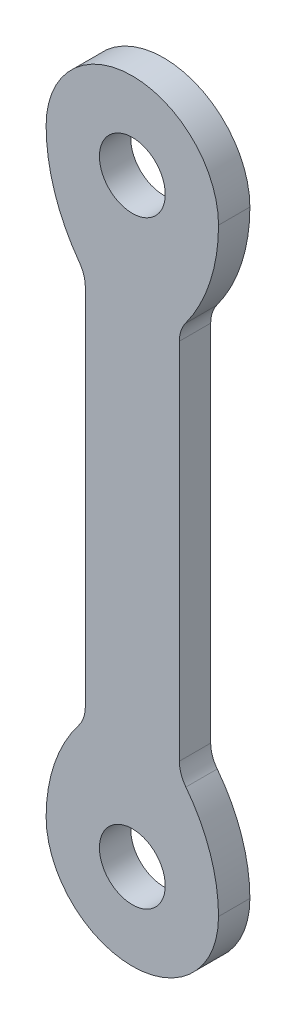
ISO-10303-21;
HEADER;
FILE_DESCRIPTION(('STEP AP214'),'2;1');
FILE_NAME('part.step','',(''),(''),'','','');
FILE_SCHEMA(('AUTOMOTIVE_DESIGN { 1 0 10303 214 1 1 1 1 }'));
ENDSEC;
DATA;
#1=APPLICATION_CONTEXT('core data for automotive mechanical design processes');
#2=APPLICATION_PROTOCOL_DEFINITION('international standard','automotive_design',2000,#1);
#3=PRODUCT_CONTEXT('',#1,'mechanical');
#4=PRODUCT('Part','Part','',(#3));
#5=PRODUCT_RELATED_PRODUCT_CATEGORY('part','',(#4));
#6=PRODUCT_DEFINITION_FORMATION('','',#4);
#7=PRODUCT_DEFINITION_CONTEXT('part definition',#1,'design');
#8=PRODUCT_DEFINITION('design','',#6,#7);
#9=PRODUCT_DEFINITION_SHAPE('','',#8);
#10=(LENGTH_UNIT() NAMED_UNIT(*) SI_UNIT(.MILLI.,.METRE.));
#11=(NAMED_UNIT(*) PLANE_ANGLE_UNIT() SI_UNIT($,.RADIAN.));
#12=(NAMED_UNIT(*) SI_UNIT($,.STERADIAN.) SOLID_ANGLE_UNIT());
#13=UNCERTAINTY_MEASURE_WITH_UNIT(LENGTH_MEASURE(1.E-05),#10,'distance_accuracy_value','');
#14=(GEOMETRIC_REPRESENTATION_CONTEXT(3) GLOBAL_UNCERTAINTY_ASSIGNED_CONTEXT((#13)) GLOBAL_UNIT_ASSIGNED_CONTEXT((#10,
#11,#12)) REPRESENTATION_CONTEXT('',''));
#15=CARTESIAN_POINT('',(0.,0.,0.));
#16=DIRECTION('',(0.,0.,1.));
#17=DIRECTION('',(1.,0.,0.));
#18=AXIS2_PLACEMENT_3D('',#15,#16,#17);
#19=CARTESIAN_POINT('',(0.,0.,10.));
#20=DIRECTION('',(0.,0.,-1.));
#21=DIRECTION('',(-1.,0.,0.));
#22=AXIS2_PLACEMENT_3D('',#19,#20,#21);
#23=CYLINDRICAL_SURFACE('',#22,27.5);
#24=CARTESIAN_POINT('',(0.,0.,0.));
#25=DIRECTION('',(0.,0.,1.));
#26=DIRECTION('',(1.,0.,0.));
#27=AXIS2_PLACEMENT_3D('',#24,#25,#26);
#28=CIRCLE('',#27,27.5);
#29=CARTESIAN_POINT('',(-27.5,-1.77635683940025E-13,0.));
#30=VERTEX_POINT('',#29);
#31=CARTESIAN_POINT('',(27.5,0.,0.));
#32=VERTEX_POINT('',#31);
#33=EDGE_CURVE('E164',#30,#32,#28,.T.);
#34=ORIENTED_EDGE('',*,*,#33,.T.);
#35=DIRECTION('',(0.,0.,-1.));
#36=VECTOR('',#35,1.);
#37=CARTESIAN_POINT('',(27.5,0.,10.));
#38=LINE('',#37,#36);
#39=CARTESIAN_POINT('',(27.5,0.,10.));
#40=VERTEX_POINT('',#39);
#41=EDGE_CURVE('E11',#40,#32,#38,.T.);
#42=ORIENTED_EDGE('',*,*,#41,.F.);
#43=CARTESIAN_POINT('',(0.,0.,10.));
#44=DIRECTION('',(0.,0.,1.));
#45=DIRECTION('',(1.,0.,0.));
#46=AXIS2_PLACEMENT_3D('',#43,#44,#45);
#47=CIRCLE('',#46,27.5);
#48=CARTESIAN_POINT('',(-27.5,-1.77635683940025E-13,10.));
#49=VERTEX_POINT('',#48);
#50=EDGE_CURVE('E190',#49,#40,#47,.T.);
#51=ORIENTED_EDGE('',*,*,#50,.F.);
#52=DIRECTION('',(0.,0.,-1.));
#53=VECTOR('',#52,1.);
#54=CARTESIAN_POINT('',(-27.5,-1.77635683940025E-13,10.));
#55=LINE('',#54,#53);
#56=EDGE_CURVE('E160',#49,#30,#55,.T.);
#57=ORIENTED_EDGE('',*,*,#56,.T.);
#58=EDGE_LOOP('',(#34,#42,#51,#57));
#59=FACE_BOUND('',#58,.T.);
#60=ADVANCED_FACE('F38',(#59),#23,.T.);
#61=CARTESIAN_POINT('',(-22.5,0.,10.));
#62=DIRECTION('',(0.,0.,-1.));
#63=DIRECTION('',(-1.,0.,0.));
#64=AXIS2_PLACEMENT_3D('',#61,#62,#63);
#65=CYLINDRICAL_SURFACE('',#64,50.);
#66=CARTESIAN_POINT('',(-22.5,0.,0.));
#67=DIRECTION('',(0.,0.,1.));
#68=DIRECTION('',(1.,0.,0.));
#69=AXIS2_PLACEMENT_3D('',#66,#67,#68);
#70=CIRCLE('',#69,50.);
#71=CARTESIAN_POINT('',(17.0833333333333,30.547663122115,0.));
#72=VERTEX_POINT('',#71);
#73=EDGE_CURVE('E168',#32,#72,#70,.T.);
#74=ORIENTED_EDGE('',*,*,#73,.T.);
#75=DIRECTION('',(0.,0.,-1.));
#76=VECTOR('',#75,1.);
#77=CARTESIAN_POINT('',(17.0833333333333,30.547663122115,10.));
#78=LINE('',#77,#76);
#79=CARTESIAN_POINT('',(17.0833333333333,30.547663122115,10.));
#80=VERTEX_POINT('',#79);
#81=EDGE_CURVE('E47',#80,#72,#78,.T.);
#82=ORIENTED_EDGE('',*,*,#81,.F.);
#83=CARTESIAN_POINT('',(-22.5,0.,10.));
#84=DIRECTION('',(0.,0.,1.));
#85=DIRECTION('',(1.,0.,0.));
#86=AXIS2_PLACEMENT_3D('',#83,#84,#85);
#87=CIRCLE('',#86,50.);
#88=EDGE_CURVE('E114',#40,#80,#87,.T.);
#89=ORIENTED_EDGE('',*,*,#88,.F.);
#90=ORIENTED_EDGE('',*,*,#41,.T.);
#91=EDGE_LOOP('',(#74,#82,#89,#90));
#92=FACE_BOUND('',#91,.T.);
#93=ADVANCED_FACE('F270',(#92),#65,.T.);
#94=CARTESIAN_POINT('',(25.,36.6571957465379,10.));
#95=DIRECTION('',(0.,0.,-1.));
#96=DIRECTION('',(-1.,0.,0.));
#97=AXIS2_PLACEMENT_3D('',#94,#95,#96);
#98=CYLINDRICAL_SURFACE('',#97,10.);
#99=CARTESIAN_POINT('',(25.,36.6571957465379,0.));
#100=DIRECTION('',(0.,0.,-1.));
#101=DIRECTION('',(-1.,0.,0.));
#102=AXIS2_PLACEMENT_3D('',#99,#100,#101);
#103=CIRCLE('',#102,10.);
#104=CARTESIAN_POINT('',(15.,36.6571957465379,0.));
#105=VERTEX_POINT('',#104);
#106=EDGE_CURVE('E172',#72,#105,#103,.T.);
#107=ORIENTED_EDGE('',*,*,#106,.T.);
#108=DIRECTION('',(0.,0.,-1.));
#109=VECTOR('',#108,1.);
#110=CARTESIAN_POINT('',(15.,36.6571957465379,10.));
#111=LINE('',#110,#109);
#112=CARTESIAN_POINT('',(15.,36.6571957465379,10.));
#113=VERTEX_POINT('',#112);
#114=EDGE_CURVE('E210',#113,#105,#111,.T.);
#115=ORIENTED_EDGE('',*,*,#114,.F.);
#116=CARTESIAN_POINT('',(25.,36.6571957465379,10.));
#117=DIRECTION('',(0.,0.,-1.));
#118=DIRECTION('',(-1.,0.,0.));
#119=AXIS2_PLACEMENT_3D('',#116,#117,#118);
#120=CIRCLE('',#119,10.);
#121=EDGE_CURVE('E218',#80,#113,#120,.T.);
#122=ORIENTED_EDGE('',*,*,#121,.F.);
#123=ORIENTED_EDGE('',*,*,#81,.T.);
#124=EDGE_LOOP('',(#107,#115,#122,#123));
#125=FACE_BOUND('',#124,.T.);
#126=ADVANCED_FACE('F216',(#125),#98,.F.);
#127=CARTESIAN_POINT('',(15.,36.6571957465379,10.));
#128=DIRECTION('',(-1.,0.,0.));
#129=DIRECTION('',(0.,0.,1.));
#130=AXIS2_PLACEMENT_3D('',#127,#128,#129);
#131=PLANE('',#130);
#132=DIRECTION('',(0.,1.,0.));
#133=VECTOR('',#132,1.);
#134=CARTESIAN_POINT('',(15.,36.6571957465379,0.));
#135=LINE('',#134,#133);
#136=CARTESIAN_POINT('',(15.,152.67572570811,0.));
#137=VERTEX_POINT('',#136);
#138=EDGE_CURVE('E174',#105,#137,#135,.T.);
#139=ORIENTED_EDGE('',*,*,#138,.T.);
#140=DIRECTION('',(0.,0.,-1.));
#141=VECTOR('',#140,1.);
#142=CARTESIAN_POINT('',(15.,152.67572570811,10.));
#143=LINE('',#142,#141);
#144=CARTESIAN_POINT('',(15.,152.67572570811,10.));
#145=VERTEX_POINT('',#144);
#146=EDGE_CURVE('E207',#145,#137,#143,.T.);
#147=ORIENTED_EDGE('',*,*,#146,.F.);
#148=DIRECTION('',(0.,1.,0.));
#149=VECTOR('',#148,1.);
#150=CARTESIAN_POINT('',(15.,36.6571957465379,10.));
#151=LINE('',#150,#149);
#152=EDGE_CURVE('E236',#113,#145,#151,.T.);
#153=ORIENTED_EDGE('',*,*,#152,.F.);
#154=ORIENTED_EDGE('',*,*,#114,.T.);
#155=EDGE_LOOP('',(#139,#147,#153,#154));
#156=FACE_BOUND('',#155,.T.);
#157=ADVANCED_FACE('F227',(#156),#131,.F.);
#158=CARTESIAN_POINT('',(25.,152.67572570811,10.));
#159=DIRECTION('',(0.,0.,-1.));
#160=DIRECTION('',(-1.,0.,0.));
#161=AXIS2_PLACEMENT_3D('',#158,#159,#160);
#162=CYLINDRICAL_SURFACE('',#161,10.);
#163=CARTESIAN_POINT('',(25.,152.67572570811,0.));
#164=DIRECTION('',(0.,0.,-1.));
#165=DIRECTION('',(1.,0.,0.));
#166=AXIS2_PLACEMENT_3D('',#163,#164,#165);
#167=CIRCLE('',#166,10.);
#168=CARTESIAN_POINT('',(16.9230769230769,158.571767906863,0.));
#169=VERTEX_POINT('',#168);
#170=EDGE_CURVE('E176',#137,#169,#167,.T.);
#171=ORIENTED_EDGE('',*,*,#170,.T.);
#172=DIRECTION('',(0.,0.,-1.));
#173=VECTOR('',#172,1.);
#174=CARTESIAN_POINT('',(16.9230769230769,158.571767906863,10.));
#175=LINE('',#174,#173);
#176=CARTESIAN_POINT('',(16.9230769230769,158.571767906863,10.));
#177=VERTEX_POINT('',#176);
#178=EDGE_CURVE('E204',#177,#169,#175,.T.);
#179=ORIENTED_EDGE('',*,*,#178,.F.);
#180=CARTESIAN_POINT('',(25.,152.67572570811,10.));
#181=DIRECTION('',(0.,0.,-1.));
#182=DIRECTION('',(1.,0.,0.));
#183=AXIS2_PLACEMENT_3D('',#180,#181,#182);
#184=CIRCLE('',#183,10.);
#185=EDGE_CURVE('E233',#145,#177,#184,.T.);
#186=ORIENTED_EDGE('',*,*,#185,.F.);
#187=ORIENTED_EDGE('',*,*,#146,.T.);
#188=EDGE_LOOP('',(#171,#179,#186,#187));
#189=FACE_BOUND('',#188,.T.);
#190=ADVANCED_FACE('F231',(#189),#162,.F.);
#191=CARTESIAN_POINT('',(-27.5,191.,10.));
#192=DIRECTION('',(0.,0.,-1.));
#193=DIRECTION('',(-1.,0.,0.));
#194=AXIS2_PLACEMENT_3D('',#191,#192,#193);
#195=CYLINDRICAL_SURFACE('',#194,55.);
#196=CARTESIAN_POINT('',(-27.5,191.,0.));
#197=DIRECTION('',(0.,0.,1.));
#198=DIRECTION('',(-1.,0.,0.));
#199=AXIS2_PLACEMENT_3D('',#196,#197,#198);
#200=CIRCLE('',#199,55.);
#201=CARTESIAN_POINT('',(27.5,191.,0.));
#202=VERTEX_POINT('',#201);
#203=EDGE_CURVE('E178',#169,#202,#200,.T.);
#204=ORIENTED_EDGE('',*,*,#203,.T.);
#205=DIRECTION('',(0.,0.,-1.));
#206=VECTOR('',#205,1.);
#207=CARTESIAN_POINT('',(27.5,191.,10.));
#208=LINE('',#207,#206);
#209=CARTESIAN_POINT('',(27.5,191.,10.));
#210=VERTEX_POINT('',#209);
#211=EDGE_CURVE('E201',#210,#202,#208,.T.);
#212=ORIENTED_EDGE('',*,*,#211,.F.);
#213=CARTESIAN_POINT('',(-27.5,191.,10.));
#214=DIRECTION('',(0.,0.,1.));
#215=DIRECTION('',(-1.,0.,0.));
#216=AXIS2_PLACEMENT_3D('',#213,#214,#215);
#217=CIRCLE('',#216,55.);
#218=EDGE_CURVE('E235',#177,#210,#217,.T.);
#219=ORIENTED_EDGE('',*,*,#218,.F.);
#220=ORIENTED_EDGE('',*,*,#178,.T.);
#221=EDGE_LOOP('',(#204,#212,#219,#220));
#222=FACE_BOUND('',#221,.T.);
#223=ADVANCED_FACE('F283',(#222),#195,.T.);
#224=CARTESIAN_POINT('',(0.,191.,10.));
#225=DIRECTION('',(0.,0.,-1.));
#226=DIRECTION('',(-1.,0.,0.));
#227=AXIS2_PLACEMENT_3D('',#224,#225,#226);
#228=CYLINDRICAL_SURFACE('',#227,27.5);
#229=CARTESIAN_POINT('',(0.,191.,0.));
#230=DIRECTION('',(0.,0.,1.));
#231=DIRECTION('',(1.,0.,0.));
#232=AXIS2_PLACEMENT_3D('',#229,#230,#231);
#233=CIRCLE('',#232,27.5);
#234=CARTESIAN_POINT('',(-27.5,191.,0.));
#235=VERTEX_POINT('',#234);
#236=EDGE_CURVE('E180',#202,#235,#233,.T.);
#237=ORIENTED_EDGE('',*,*,#236,.T.);
#238=DIRECTION('',(0.,0.,-1.));
#239=VECTOR('',#238,1.);
#240=CARTESIAN_POINT('',(-27.5,191.,10.));
#241=LINE('',#240,#239);
#242=CARTESIAN_POINT('',(-27.5,191.,10.));
#243=VERTEX_POINT('',#242);
#244=EDGE_CURVE('E198',#243,#235,#241,.T.);
#245=ORIENTED_EDGE('',*,*,#244,.F.);
#246=CARTESIAN_POINT('',(0.,191.,10.));
#247=DIRECTION('',(0.,0.,1.));
#248=DIRECTION('',(1.,0.,0.));
#249=AXIS2_PLACEMENT_3D('',#246,#247,#248);
#250=CIRCLE('',#249,27.5);
#251=EDGE_CURVE('E238',#210,#243,#250,.T.);
#252=ORIENTED_EDGE('',*,*,#251,.F.);
#253=ORIENTED_EDGE('',*,*,#211,.T.);
#254=EDGE_LOOP('',(#237,#245,#252,#253));
#255=FACE_BOUND('',#254,.T.);
#256=ADVANCED_FACE('F286',(#255),#228,.T.);
#257=CARTESIAN_POINT('',(27.5,191.,10.));
#258=DIRECTION('',(0.,0.,-1.));
#259=DIRECTION('',(-1.,0.,0.));
#260=AXIS2_PLACEMENT_3D('',#257,#258,#259);
#261=CYLINDRICAL_SURFACE('',#260,55.);
#262=CARTESIAN_POINT('',(27.5,191.,0.));
#263=DIRECTION('',(0.,0.,1.));
#264=DIRECTION('',(1.,0.,0.));
#265=AXIS2_PLACEMENT_3D('',#262,#263,#264);
#266=CIRCLE('',#265,55.);
#267=CARTESIAN_POINT('',(-16.9230769230769,158.571767906863,0.));
#268=VERTEX_POINT('',#267);
#269=EDGE_CURVE('E182',#235,#268,#266,.T.);
#270=ORIENTED_EDGE('',*,*,#269,.T.);
#271=DIRECTION('',(0.,0.,-1.));
#272=VECTOR('',#271,1.);
#273=CARTESIAN_POINT('',(-16.9230769230769,158.571767906863,10.));
#274=LINE('',#273,#272);
#275=CARTESIAN_POINT('',(-16.9230769230769,158.571767906863,10.));
#276=VERTEX_POINT('',#275);
#277=EDGE_CURVE('E195',#276,#268,#274,.T.);
#278=ORIENTED_EDGE('',*,*,#277,.F.);
#279=CARTESIAN_POINT('',(27.5,191.,10.));
#280=DIRECTION('',(0.,0.,1.));
#281=DIRECTION('',(1.,0.,0.));
#282=AXIS2_PLACEMENT_3D('',#279,#280,#281);
#283=CIRCLE('',#282,55.);
#284=EDGE_CURVE('E244',#243,#276,#283,.T.);
#285=ORIENTED_EDGE('',*,*,#284,.F.);
#286=ORIENTED_EDGE('',*,*,#244,.T.);
#287=EDGE_LOOP('',(#270,#278,#285,#286));
#288=FACE_BOUND('',#287,.T.);
#289=ADVANCED_FACE('F250',(#288),#261,.T.);
#290=CARTESIAN_POINT('',(-25.,152.67572570811,10.));
#291=DIRECTION('',(0.,0.,-1.));
#292=DIRECTION('',(-1.,0.,0.));
#293=AXIS2_PLACEMENT_3D('',#290,#291,#292);
#294=CYLINDRICAL_SURFACE('',#293,10.);
#295=CARTESIAN_POINT('',(-25.,152.67572570811,0.));
#296=DIRECTION('',(0.,0.,-1.));
#297=DIRECTION('',(-1.,0.,0.));
#298=AXIS2_PLACEMENT_3D('',#295,#296,#297);
#299=CIRCLE('',#298,10.);
#300=CARTESIAN_POINT('',(-15.,152.67572570811,0.));
#301=VERTEX_POINT('',#300);
#302=EDGE_CURVE('E184',#268,#301,#299,.T.);
#303=ORIENTED_EDGE('',*,*,#302,.T.);
#304=DIRECTION('',(0.,0.,-1.));
#305=VECTOR('',#304,1.);
#306=CARTESIAN_POINT('',(-15.,152.67572570811,10.));
#307=LINE('',#306,#305);
#308=CARTESIAN_POINT('',(-15.,152.67572570811,10.));
#309=VERTEX_POINT('',#308);
#310=EDGE_CURVE('E154',#309,#301,#307,.T.);
#311=ORIENTED_EDGE('',*,*,#310,.F.);
#312=CARTESIAN_POINT('',(-25.,152.67572570811,10.));
#313=DIRECTION('',(0.,0.,-1.));
#314=DIRECTION('',(-1.,0.,0.));
#315=AXIS2_PLACEMENT_3D('',#312,#313,#314);
#316=CIRCLE('',#315,10.);
#317=EDGE_CURVE('E145',#276,#309,#316,.T.);
#318=ORIENTED_EDGE('',*,*,#317,.F.);
#319=ORIENTED_EDGE('',*,*,#277,.T.);
#320=EDGE_LOOP('',(#303,#311,#318,#319));
#321=FACE_BOUND('',#320,.T.);
#322=ADVANCED_FACE('F254',(#321),#294,.F.);
#323=CARTESIAN_POINT('',(-15.,152.67572570811,10.));
#324=DIRECTION('',(1.,0.,0.));
#325=DIRECTION('',(0.,0.,-1.));
#326=AXIS2_PLACEMENT_3D('',#323,#324,#325);
#327=PLANE('',#326);
#328=DIRECTION('',(0.,-1.,0.));
#329=VECTOR('',#328,1.);
#330=CARTESIAN_POINT('',(-15.,152.67572570811,0.));
#331=LINE('',#330,#329);
#332=CARTESIAN_POINT('',(-15.,36.6571957465379,0.));
#333=VERTEX_POINT('',#332);
#334=EDGE_CURVE('E153',#301,#333,#331,.T.);
#335=ORIENTED_EDGE('',*,*,#334,.T.);
#336=DIRECTION('',(0.,0.,-1.));
#337=VECTOR('',#336,1.);
#338=CARTESIAN_POINT('',(-15.,36.6571957465379,10.));
#339=LINE('',#338,#337);
#340=CARTESIAN_POINT('',(-15.,36.6571957465379,10.));
#341=VERTEX_POINT('',#340);
#342=EDGE_CURVE('E150',#341,#333,#339,.T.);
#343=ORIENTED_EDGE('',*,*,#342,.F.);
#344=DIRECTION('',(0.,-1.,0.));
#345=VECTOR('',#344,1.);
#346=CARTESIAN_POINT('',(-15.,152.67572570811,10.));
#347=LINE('',#346,#345);
#348=EDGE_CURVE('E139',#309,#341,#347,.T.);
#349=ORIENTED_EDGE('',*,*,#348,.F.);
#350=ORIENTED_EDGE('',*,*,#310,.T.);
#351=EDGE_LOOP('',(#335,#343,#349,#350));
#352=FACE_BOUND('',#351,.T.);
#353=ADVANCED_FACE('F151',(#352),#327,.F.);
#354=CARTESIAN_POINT('',(-25.,36.6571957465379,10.));
#355=DIRECTION('',(0.,0.,-1.));
#356=DIRECTION('',(-1.,0.,0.));
#357=AXIS2_PLACEMENT_3D('',#354,#355,#356);
#358=CYLINDRICAL_SURFACE('',#357,10.);
#359=CARTESIAN_POINT('',(-25.,36.6571957465379,0.));
#360=DIRECTION('',(0.,0.,-1.));
#361=DIRECTION('',(1.,0.,0.));
#362=AXIS2_PLACEMENT_3D('',#359,#360,#361);
#363=CIRCLE('',#362,10.);
#364=CARTESIAN_POINT('',(-17.0833333333333,30.547663122115,0.));
#365=VERTEX_POINT('',#364);
#366=EDGE_CURVE('E99',#333,#365,#363,.T.);
#367=ORIENTED_EDGE('',*,*,#366,.T.);
#368=DIRECTION('',(0.,0.,-1.));
#369=VECTOR('',#368,1.);
#370=CARTESIAN_POINT('',(-17.0833333333333,30.547663122115,10.));
#371=LINE('',#370,#369);
#372=CARTESIAN_POINT('',(-17.0833333333333,30.547663122115,10.));
#373=VERTEX_POINT('',#372);
#374=EDGE_CURVE('E155',#373,#365,#371,.T.);
#375=ORIENTED_EDGE('',*,*,#374,.F.);
#376=CARTESIAN_POINT('',(-25.,36.6571957465379,10.));
#377=DIRECTION('',(0.,0.,-1.));
#378=DIRECTION('',(1.,0.,0.));
#379=AXIS2_PLACEMENT_3D('',#376,#377,#378);
#380=CIRCLE('',#379,10.);
#381=EDGE_CURVE('E143',#341,#373,#380,.T.);
#382=ORIENTED_EDGE('',*,*,#381,.F.);
#383=ORIENTED_EDGE('',*,*,#342,.T.);
#384=EDGE_LOOP('',(#367,#375,#382,#383));
#385=FACE_BOUND('',#384,.T.);
#386=ADVANCED_FACE('F157',(#385),#358,.F.);
#387=CARTESIAN_POINT('',(22.5,0.,10.));
#388=DIRECTION('',(0.,0.,-1.));
#389=DIRECTION('',(-1.,0.,0.));
#390=AXIS2_PLACEMENT_3D('',#387,#388,#389);
#391=CYLINDRICAL_SURFACE('',#390,50.);
#392=CARTESIAN_POINT('',(22.5,0.,0.));
#393=DIRECTION('',(0.,0.,1.));
#394=DIRECTION('',(-1.,0.,0.));
#395=AXIS2_PLACEMENT_3D('',#392,#393,#394);
#396=CIRCLE('',#395,50.);
#397=EDGE_CURVE('E106',#365,#30,#396,.T.);
#398=ORIENTED_EDGE('',*,*,#397,.T.);
#399=ORIENTED_EDGE('',*,*,#56,.F.);
#400=CARTESIAN_POINT('',(22.5,0.,10.));
#401=DIRECTION('',(0.,0.,1.));
#402=DIRECTION('',(-1.,0.,0.));
#403=AXIS2_PLACEMENT_3D('',#400,#401,#402);
#404=CIRCLE('',#403,50.);
#405=EDGE_CURVE('E57',#373,#49,#404,.T.);
#406=ORIENTED_EDGE('',*,*,#405,.F.);
#407=ORIENTED_EDGE('',*,*,#374,.T.);
#408=EDGE_LOOP('',(#398,#399,#406,#407));
#409=FACE_BOUND('',#408,.T.);
#410=ADVANCED_FACE('F258',(#409),#391,.T.);
#411=CARTESIAN_POINT('',(0.,0.,10.));
#412=DIRECTION('',(0.,0.,1.));
#413=DIRECTION('',(1.,0.,0.));
#414=AXIS2_PLACEMENT_3D('',#411,#412,#413);
#415=PLANE('',#414);
#416=CARTESIAN_POINT('',(0.,191.,10.));
#417=DIRECTION('',(0.,0.,1.));
#418=DIRECTION('',(1.,0.,0.));
#419=AXIS2_PLACEMENT_3D('',#416,#417,#418);
#420=CIRCLE('',#419,10.5);
#421=CARTESIAN_POINT('',(10.5,191.,10.));
#422=VERTEX_POINT('',#421);
#423=EDGE_CURVE('E349',#422,#422,#420,.T.);
#424=ORIENTED_EDGE('',*,*,#423,.F.);
#425=EDGE_LOOP('',(#424));
#426=FACE_BOUND('',#425,.T.);
#427=CARTESIAN_POINT('',(0.,0.,10.));
#428=DIRECTION('',(0.,0.,1.));
#429=DIRECTION('',(1.,0.,0.));
#430=AXIS2_PLACEMENT_3D('',#427,#428,#429);
#431=CIRCLE('',#430,10.5);
#432=CARTESIAN_POINT('',(10.5,0.,10.));
#433=VERTEX_POINT('',#432);
#434=EDGE_CURVE('E356',#433,#433,#431,.T.);
#435=ORIENTED_EDGE('',*,*,#434,.F.);
#436=EDGE_LOOP('',(#435));
#437=FACE_BOUND('',#436,.T.);
#438=ORIENTED_EDGE('',*,*,#50,.T.);
#439=ORIENTED_EDGE('',*,*,#88,.T.);
#440=ORIENTED_EDGE('',*,*,#121,.T.);
#441=ORIENTED_EDGE('',*,*,#152,.T.);
#442=ORIENTED_EDGE('',*,*,#185,.T.);
#443=ORIENTED_EDGE('',*,*,#218,.T.);
#444=ORIENTED_EDGE('',*,*,#251,.T.);
#445=ORIENTED_EDGE('',*,*,#284,.T.);
#446=ORIENTED_EDGE('',*,*,#317,.T.);
#447=ORIENTED_EDGE('',*,*,#348,.T.);
#448=ORIENTED_EDGE('',*,*,#381,.T.);
#449=ORIENTED_EDGE('',*,*,#405,.T.);
#450=EDGE_LOOP('',(#438,#439,#440,#441,#442,#443,#444,#445,#446,#447,#448,#449));
#451=FACE_BOUND('',#450,.T.);
#452=ADVANCED_FACE('F141',(#426,#437,#451),#415,.T.);
#453=CARTESIAN_POINT('',(0.,0.,0.));
#454=DIRECTION('',(0.,0.,1.));
#455=DIRECTION('',(1.,0.,0.));
#456=AXIS2_PLACEMENT_3D('',#453,#454,#455);
#457=PLANE('',#456);
#458=CARTESIAN_POINT('',(0.,191.,0.));
#459=DIRECTION('',(0.,0.,1.));
#460=DIRECTION('',(1.,0.,0.));
#461=AXIS2_PLACEMENT_3D('',#458,#459,#460);
#462=CIRCLE('',#461,10.5);
#463=CARTESIAN_POINT('',(10.5,191.,0.));
#464=VERTEX_POINT('',#463);
#465=EDGE_CURVE('E169',#464,#464,#462,.F.);
#466=ORIENTED_EDGE('',*,*,#465,.F.);
#467=EDGE_LOOP('',(#466));
#468=FACE_BOUND('',#467,.T.);
#469=CARTESIAN_POINT('',(0.,0.,0.));
#470=DIRECTION('',(0.,0.,1.));
#471=DIRECTION('',(1.,0.,0.));
#472=AXIS2_PLACEMENT_3D('',#469,#470,#471);
#473=CIRCLE('',#472,10.5);
#474=CARTESIAN_POINT('',(10.5,0.,0.));
#475=VERTEX_POINT('',#474);
#476=EDGE_CURVE('E353',#475,#475,#473,.F.);
#477=ORIENTED_EDGE('',*,*,#476,.F.);
#478=EDGE_LOOP('',(#477));
#479=FACE_BOUND('',#478,.T.);
#480=ORIENTED_EDGE('',*,*,#33,.F.);
#481=ORIENTED_EDGE('',*,*,#397,.F.);
#482=ORIENTED_EDGE('',*,*,#366,.F.);
#483=ORIENTED_EDGE('',*,*,#334,.F.);
#484=ORIENTED_EDGE('',*,*,#302,.F.);
#485=ORIENTED_EDGE('',*,*,#269,.F.);
#486=ORIENTED_EDGE('',*,*,#236,.F.);
#487=ORIENTED_EDGE('',*,*,#203,.F.);
#488=ORIENTED_EDGE('',*,*,#170,.F.);
#489=ORIENTED_EDGE('',*,*,#138,.F.);
#490=ORIENTED_EDGE('',*,*,#106,.F.);
#491=ORIENTED_EDGE('',*,*,#73,.F.);
#492=EDGE_LOOP('',(#480,#481,#482,#483,#484,#485,#486,#487,#488,#489,#490,#491));
#493=FACE_BOUND('',#492,.T.);
#494=ADVANCED_FACE('F222',(#468,#479,#493),#457,.F.);
#495=CARTESIAN_POINT('',(0.,0.,-0.000999999999999265));
#496=DIRECTION('',(0.,0.,1.));
#497=DIRECTION('',(1.,0.,0.));
#498=AXIS2_PLACEMENT_3D('',#495,#496,#497);
#499=CYLINDRICAL_SURFACE('',#498,10.5);
#500=ORIENTED_EDGE('',*,*,#434,.T.);
#501=EDGE_LOOP('',(#500));
#502=FACE_BOUND('',#501,.T.);
#503=ORIENTED_EDGE('',*,*,#476,.T.);
#504=EDGE_LOOP('',(#503));
#505=FACE_BOUND('',#504,.T.);
#506=ADVANCED_FACE('F323',(#502,#505),#499,.F.);
#507=CARTESIAN_POINT('',(0.,191.,-0.000999999999999265));
#508=DIRECTION('',(0.,0.,1.));
#509=DIRECTION('',(1.,0.,0.));
#510=AXIS2_PLACEMENT_3D('',#507,#508,#509);
#511=CYLINDRICAL_SURFACE('',#510,10.5);
#512=ORIENTED_EDGE('',*,*,#423,.T.);
#513=EDGE_LOOP('',(#512));
#514=FACE_BOUND('',#513,.T.);
#515=ORIENTED_EDGE('',*,*,#465,.T.);
#516=EDGE_LOOP('',(#515));
#517=FACE_BOUND('',#516,.T.);
#518=ADVANCED_FACE('F332',(#514,#517),#511,.F.);
#519=CLOSED_SHELL('',(#60,#93,#126,#157,#190,#223,#256,#289,#322,#353,#386,#410,#452,#494,#506,#518));
#520=MANIFOLD_SOLID_BREP('B2',#519);
#521=ADVANCED_BREP_SHAPE_REPRESENTATION('',(#18,#520),#14);
#522=SHAPE_DEFINITION_REPRESENTATION(#9,#521);
ENDSEC;
END-ISO-10303-21;
